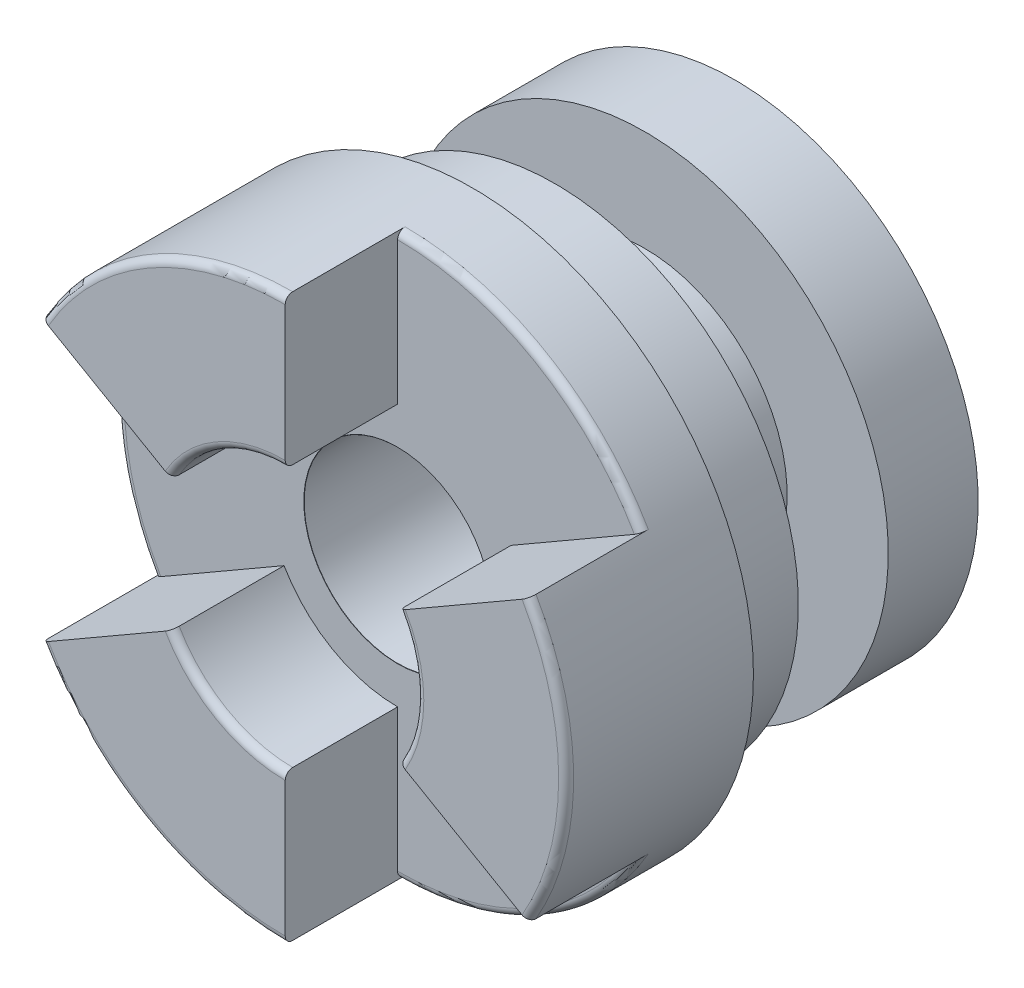
ISO-10303-21;
HEADER;
FILE_DESCRIPTION(('STEP AP214'),'2;1');
FILE_NAME('part.step','',(''),(''),'','','');
FILE_SCHEMA(('AUTOMOTIVE_DESIGN { 1 0 10303 214 1 1 1 1 }'));
ENDSEC;
DATA;
#1=APPLICATION_CONTEXT('core data for automotive mechanical design processes');
#2=APPLICATION_PROTOCOL_DEFINITION('international standard','automotive_design',2000,#1);
#3=PRODUCT_CONTEXT('',#1,'mechanical');
#4=PRODUCT('Part','Part','',(#3));
#5=PRODUCT_RELATED_PRODUCT_CATEGORY('part','',(#4));
#6=PRODUCT_DEFINITION_FORMATION('','',#4);
#7=PRODUCT_DEFINITION_CONTEXT('part definition',#1,'design');
#8=PRODUCT_DEFINITION('design','',#6,#7);
#9=PRODUCT_DEFINITION_SHAPE('','',#8);
#10=(LENGTH_UNIT() NAMED_UNIT(*) SI_UNIT(.MILLI.,.METRE.));
#11=(NAMED_UNIT(*) PLANE_ANGLE_UNIT() SI_UNIT($,.RADIAN.));
#12=(NAMED_UNIT(*) SI_UNIT($,.STERADIAN.) SOLID_ANGLE_UNIT());
#13=UNCERTAINTY_MEASURE_WITH_UNIT(LENGTH_MEASURE(1.E-05),#10,'distance_accuracy_value','');
#14=(GEOMETRIC_REPRESENTATION_CONTEXT(3) GLOBAL_UNCERTAINTY_ASSIGNED_CONTEXT((#13)) GLOBAL_UNIT_ASSIGNED_CONTEXT((#10,
#11,#12)) REPRESENTATION_CONTEXT('',''));
#15=CARTESIAN_POINT('',(0.,0.,0.));
#16=DIRECTION('',(0.,0.,1.));
#17=DIRECTION('',(1.,0.,0.));
#18=AXIS2_PLACEMENT_3D('',#15,#16,#17);
#19=CARTESIAN_POINT('',(0.,0.,-35.));
#20=DIRECTION('',(0.,0.,-1.));
#21=DIRECTION('',(-1.,0.,0.));
#22=AXIS2_PLACEMENT_3D('',#19,#20,#21);
#23=PLANE('',#22);
#24=CARTESIAN_POINT('',(0.,0.,-35.));
#25=DIRECTION('',(0.,0.,-1.));
#26=DIRECTION('',(-1.,0.,0.));
#27=AXIS2_PLACEMENT_3D('',#24,#25,#26);
#28=CIRCLE('',#27,32.5);
#29=CARTESIAN_POINT('',(-32.5,0.,-35.));
#30=VERTEX_POINT('',#29);
#31=EDGE_CURVE('E452',#30,#30,#28,.T.);
#32=ORIENTED_EDGE('',*,*,#31,.T.);
#33=EDGE_LOOP('',(#32));
#34=FACE_BOUND('',#33,.T.);
#35=CARTESIAN_POINT('',(0.,0.,-35.));
#36=DIRECTION('',(0.,0.,1.));
#37=DIRECTION('',(1.,0.,0.));
#38=AXIS2_PLACEMENT_3D('',#35,#36,#37);
#39=CIRCLE('',#38,12.5);
#40=CARTESIAN_POINT('',(11.7553179455087,4.25,-35.));
#41=VERTEX_POINT('',#40);
#42=CARTESIAN_POINT('',(11.7553179455087,-4.25,-35.));
#43=VERTEX_POINT('',#42);
#44=EDGE_CURVE('E520',#41,#43,#39,.T.);
#45=ORIENTED_EDGE('',*,*,#44,.T.);
#46=DIRECTION('',(-1.,0.,0.));
#47=VECTOR('',#46,1.);
#48=CARTESIAN_POINT('',(15.8,-4.25,-35.));
#49=LINE('',#48,#47);
#50=CARTESIAN_POINT('',(15.8,-4.25,-35.));
#51=VERTEX_POINT('',#50);
#52=EDGE_CURVE('E537',#51,#43,#49,.T.);
#53=ORIENTED_EDGE('',*,*,#52,.F.);
#54=DIRECTION('',(0.,1.,0.));
#55=VECTOR('',#54,1.);
#56=CARTESIAN_POINT('',(15.8,-4.25,-35.));
#57=LINE('',#56,#55);
#58=CARTESIAN_POINT('',(15.8,4.25,-35.));
#59=VERTEX_POINT('',#58);
#60=EDGE_CURVE('E535',#51,#59,#57,.T.);
#61=ORIENTED_EDGE('',*,*,#60,.T.);
#62=DIRECTION('',(-1.,0.,0.));
#63=VECTOR('',#62,1.);
#64=CARTESIAN_POINT('',(15.8,4.25,-35.));
#65=LINE('',#64,#63);
#66=EDGE_CURVE('E221',#59,#41,#65,.T.);
#67=ORIENTED_EDGE('',*,*,#66,.T.);
#68=EDGE_LOOP('',(#45,#53,#61,#67));
#69=FACE_BOUND('',#68,.T.);
#70=ADVANCED_FACE('F38',(#34,#69),#23,.T.);
#71=CARTESIAN_POINT('',(0.,0.,10.));
#72=DIRECTION('',(0.,0.,1.));
#73=DIRECTION('',(1.,0.,0.));
#74=AXIS2_PLACEMENT_3D('',#71,#72,#73);
#75=CYLINDRICAL_SURFACE('',#74,12.5);
#76=DIRECTION('',(0.,0.,1.));
#77=VECTOR('',#76,1.);
#78=CARTESIAN_POINT('',(11.7553179455087,-4.25,10.));
#79=LINE('',#78,#77);
#80=CARTESIAN_POINT('',(11.7553179455088,-4.25,9.975));
#81=VERTEX_POINT('',#80);
#82=EDGE_CURVE('E531',#43,#81,#79,.T.);
#83=ORIENTED_EDGE('',*,*,#82,.F.);
#84=ORIENTED_EDGE('',*,*,#44,.F.);
#85=DIRECTION('',(0.,0.,1.));
#86=VECTOR('',#85,1.);
#87=CARTESIAN_POINT('',(11.7553179455087,4.25,10.));
#88=LINE('',#87,#86);
#89=CARTESIAN_POINT('',(11.7553179455087,4.25,9.975));
#90=VERTEX_POINT('',#89);
#91=EDGE_CURVE('E533',#41,#90,#88,.T.);
#92=ORIENTED_EDGE('',*,*,#91,.T.);
#93=CARTESIAN_POINT('',(0.,0.,9.975));
#94=DIRECTION('',(0.,0.,1.));
#95=DIRECTION('',(1.,0.,0.));
#96=AXIS2_PLACEMENT_3D('',#93,#94,#95);
#97=CIRCLE('',#96,12.5);
#98=EDGE_CURVE('E527',#90,#81,#97,.T.);
#99=ORIENTED_EDGE('',*,*,#98,.T.);
#100=EDGE_LOOP('',(#83,#84,#92,#99));
#101=FACE_BOUND('',#100,.T.);
#102=ADVANCED_FACE('F274',(#101),#75,.F.);
#103=CARTESIAN_POINT('',(0.,0.,10.));
#104=DIRECTION('',(0.,0.,1.));
#105=DIRECTION('',(1.,0.,0.));
#106=AXIS2_PLACEMENT_3D('',#103,#104,#105);
#107=PLANE('',#106);
#108=DIRECTION('',(1.,0.,0.));
#109=VECTOR('',#108,1.);
#110=CARTESIAN_POINT('',(0.,-4.25,10.));
#111=LINE('',#110,#109);
#112=CARTESIAN_POINT('',(11.7818981917177,-4.25,10.));
#113=VERTEX_POINT('',#112);
#114=CARTESIAN_POINT('',(15.8,-4.25,10.));
#115=VERTEX_POINT('',#114);
#116=EDGE_CURVE('E233',#113,#115,#111,.T.);
#117=ORIENTED_EDGE('',*,*,#116,.F.);
#118=CARTESIAN_POINT('',(0.,0.,10.));
#119=DIRECTION('',(0.,0.,1.));
#120=DIRECTION('',(1.,0.,0.));
#121=AXIS2_PLACEMENT_3D('',#118,#119,#120);
#122=CIRCLE('',#121,12.525);
#123=CARTESIAN_POINT('',(11.7818981917177,4.25,10.));
#124=VERTEX_POINT('',#123);
#125=EDGE_CURVE('E239',#124,#113,#122,.T.);
#126=ORIENTED_EDGE('',*,*,#125,.F.);
#127=DIRECTION('',(-1.,0.,0.));
#128=VECTOR('',#127,1.);
#129=CARTESIAN_POINT('',(0.,4.25,10.));
#130=LINE('',#129,#128);
#131=CARTESIAN_POINT('',(15.8,4.25,10.));
#132=VERTEX_POINT('',#131);
#133=EDGE_CURVE('E218',#132,#124,#130,.T.);
#134=ORIENTED_EDGE('',*,*,#133,.F.);
#135=DIRECTION('',(0.,1.,0.));
#136=VECTOR('',#135,1.);
#137=CARTESIAN_POINT('',(15.8,0.,10.));
#138=LINE('',#137,#136);
#139=EDGE_CURVE('E225',#115,#132,#138,.T.);
#140=ORIENTED_EDGE('',*,*,#139,.F.);
#141=EDGE_LOOP('',(#117,#126,#134,#140));
#142=FACE_BOUND('',#141,.T.);
#143=DIRECTION('',(-0.866025403784436,0.500000000000004,0.));
#144=VECTOR('',#143,1.);
#145=CARTESIAN_POINT('',(0.,0.,10.));
#146=LINE('',#145,#144);
#147=CARTESIAN_POINT('',(-15.1554445662276,8.75000000000007,10.));
#148=VERTEX_POINT('',#147);
#149=CARTESIAN_POINT('',(-31.6099272381319,18.2500000000001,10.));
#150=VERTEX_POINT('',#149);
#151=EDGE_CURVE('E466',#148,#150,#146,.T.);
#152=ORIENTED_EDGE('',*,*,#151,.T.);
#153=CARTESIAN_POINT('',(0.,0.,10.));
#154=DIRECTION('',(0.,0.,1.));
#155=DIRECTION('',(1.,0.,0.));
#156=AXIS2_PLACEMENT_3D('',#153,#154,#155);
#157=CIRCLE('',#156,36.5);
#158=CARTESIAN_POINT('',(-31.6099272381322,-18.2499999999997,10.));
#159=VERTEX_POINT('',#158);
#160=EDGE_CURVE('E371',#150,#159,#157,.T.);
#161=ORIENTED_EDGE('',*,*,#160,.T.);
#162=DIRECTION('',(0.866025403784443,0.499999999999992,0.));
#163=VECTOR('',#162,1.);
#164=CARTESIAN_POINT('',(0.,0.,10.));
#165=LINE('',#164,#163);
#166=CARTESIAN_POINT('',(-15.1554445662278,-8.74999999999986,10.));
#167=VERTEX_POINT('',#166);
#168=EDGE_CURVE('E493',#159,#167,#165,.T.);
#169=ORIENTED_EDGE('',*,*,#168,.T.);
#170=CARTESIAN_POINT('',(0.,0.,10.));
#171=DIRECTION('',(0.,0.,1.));
#172=DIRECTION('',(1.,0.,0.));
#173=AXIS2_PLACEMENT_3D('',#170,#171,#172);
#174=CIRCLE('',#173,17.5);
#175=CARTESIAN_POINT('',(-2.41993924898765E-13,-17.5,10.));
#176=VERTEX_POINT('',#175);
#177=EDGE_CURVE('E495',#167,#176,#174,.T.);
#178=ORIENTED_EDGE('',*,*,#177,.T.);
#179=DIRECTION('',(0.,-1.,0.));
#180=VECTOR('',#179,1.);
#181=CARTESIAN_POINT('',(0.,0.,10.));
#182=LINE('',#181,#180);
#183=CARTESIAN_POINT('',(-5.06495886898328E-13,-36.5,10.));
#184=VERTEX_POINT('',#183);
#185=EDGE_CURVE('E490',#176,#184,#182,.T.);
#186=ORIENTED_EDGE('',*,*,#185,.T.);
#187=CARTESIAN_POINT('',(0.,0.,10.));
#188=DIRECTION('',(0.,0.,1.));
#189=DIRECTION('',(1.,0.,0.));
#190=AXIS2_PLACEMENT_3D('',#187,#188,#189);
#191=CIRCLE('',#190,36.5);
#192=CARTESIAN_POINT('',(31.6099272381319,-18.2500000000001,10.));
#193=VERTEX_POINT('',#192);
#194=EDGE_CURVE('E358',#184,#193,#191,.T.);
#195=ORIENTED_EDGE('',*,*,#194,.T.);
#196=DIRECTION('',(-0.866025403784436,0.500000000000004,0.));
#197=VECTOR('',#196,1.);
#198=CARTESIAN_POINT('',(0.,0.,10.));
#199=LINE('',#198,#197);
#200=CARTESIAN_POINT('',(15.1554445662276,-8.75000000000008,10.));
#201=VERTEX_POINT('',#200);
#202=EDGE_CURVE('E514',#193,#201,#199,.T.);
#203=ORIENTED_EDGE('',*,*,#202,.T.);
#204=CARTESIAN_POINT('',(0.,0.,10.));
#205=DIRECTION('',(0.,0.,1.));
#206=DIRECTION('',(1.,0.,0.));
#207=AXIS2_PLACEMENT_3D('',#204,#205,#206);
#208=CIRCLE('',#207,17.5);
#209=CARTESIAN_POINT('',(15.1554445662278,8.74999999999986,10.));
#210=VERTEX_POINT('',#209);
#211=EDGE_CURVE('E517',#201,#210,#208,.T.);
#212=ORIENTED_EDGE('',*,*,#211,.T.);
#213=DIRECTION('',(0.866025403784443,0.499999999999992,0.));
#214=VECTOR('',#213,1.);
#215=CARTESIAN_POINT('',(0.,0.,10.));
#216=LINE('',#215,#214);
#217=CARTESIAN_POINT('',(31.6099272381322,18.2499999999997,10.));
#218=VERTEX_POINT('',#217);
#219=EDGE_CURVE('E510',#210,#218,#216,.T.);
#220=ORIENTED_EDGE('',*,*,#219,.T.);
#221=CARTESIAN_POINT('',(0.,0.,10.));
#222=DIRECTION('',(0.,0.,1.));
#223=DIRECTION('',(1.,0.,0.));
#224=AXIS2_PLACEMENT_3D('',#221,#222,#223);
#225=CIRCLE('',#224,36.5);
#226=CARTESIAN_POINT('',(0.,36.5,10.));
#227=VERTEX_POINT('',#226);
#228=EDGE_CURVE('E374',#218,#227,#225,.T.);
#229=ORIENTED_EDGE('',*,*,#228,.T.);
#230=DIRECTION('',(0.,-1.,0.));
#231=VECTOR('',#230,1.);
#232=CARTESIAN_POINT('',(0.,0.,10.));
#233=LINE('',#232,#231);
#234=CARTESIAN_POINT('',(0.,17.5,10.));
#235=VERTEX_POINT('',#234);
#236=EDGE_CURVE('E470',#227,#235,#233,.T.);
#237=ORIENTED_EDGE('',*,*,#236,.T.);
#238=CARTESIAN_POINT('',(0.,0.,10.));
#239=DIRECTION('',(0.,0.,1.));
#240=DIRECTION('',(1.,0.,0.));
#241=AXIS2_PLACEMENT_3D('',#238,#239,#240);
#242=CIRCLE('',#241,17.5);
#243=EDGE_CURVE('E473',#235,#148,#242,.T.);
#244=ORIENTED_EDGE('',*,*,#243,.T.);
#245=EDGE_LOOP('',(#152,#161,#169,#178,#186,#195,#203,#212,#220,#229,#237,#244));
#246=FACE_BOUND('',#245,.T.);
#247=ADVANCED_FACE('F236',(#142,#246),#107,.T.);
#248=CARTESIAN_POINT('',(0.,0.,10.));
#249=DIRECTION('',(0.,0.,-1.));
#250=DIRECTION('',(-1.,0.,0.));
#251=AXIS2_PLACEMENT_3D('',#248,#249,#250);
#252=CYLINDRICAL_SURFACE('',#251,37.5);
#253=DIRECTION('',(0.,0.,-1.));
#254=VECTOR('',#253,1.);
#255=CARTESIAN_POINT('',(32.4759526419166,18.7499999999997,25.));
#256=LINE('',#255,#254);
#257=CARTESIAN_POINT('',(32.4759526419166,18.7499999999997,24.));
#258=VERTEX_POINT('',#257);
#259=CARTESIAN_POINT('',(32.4759526419166,18.7499999999997,9.));
#260=VERTEX_POINT('',#259);
#261=EDGE_CURVE('E505',#258,#260,#256,.T.);
#262=ORIENTED_EDGE('',*,*,#261,.F.);
#263=CARTESIAN_POINT('',(0.,0.,24.));
#264=DIRECTION('',(0.,0.,1.));
#265=DIRECTION('',(1.,0.,0.));
#266=AXIS2_PLACEMENT_3D('',#263,#264,#265);
#267=CIRCLE('',#266,37.5);
#268=CARTESIAN_POINT('',(32.4759526419164,-18.7500000000001,24.));
#269=VERTEX_POINT('',#268);
#270=EDGE_CURVE('E415',#258,#269,#267,.F.);
#271=ORIENTED_EDGE('',*,*,#270,.T.);
#272=DIRECTION('',(0.,0.,-1.));
#273=VECTOR('',#272,1.);
#274=CARTESIAN_POINT('',(32.4759526419164,-18.7500000000001,25.));
#275=LINE('',#274,#273);
#276=CARTESIAN_POINT('',(32.4759526419164,-18.7500000000001,9.));
#277=VERTEX_POINT('',#276);
#278=EDGE_CURVE('E503',#269,#277,#275,.T.);
#279=ORIENTED_EDGE('',*,*,#278,.T.);
#280=CARTESIAN_POINT('',(0.,0.,9.));
#281=DIRECTION('',(0.,0.,1.));
#282=DIRECTION('',(1.,0.,0.));
#283=AXIS2_PLACEMENT_3D('',#280,#281,#282);
#284=CIRCLE('',#283,37.5);
#285=CARTESIAN_POINT('',(-5.20417042793042E-13,-37.5,9.));
#286=VERTEX_POINT('',#285);
#287=EDGE_CURVE('E356',#277,#286,#284,.F.);
#288=ORIENTED_EDGE('',*,*,#287,.T.);
#289=DIRECTION('',(0.,0.,-1.));
#290=VECTOR('',#289,1.);
#291=CARTESIAN_POINT('',(-5.20417042793042E-13,-37.5,25.));
#292=LINE('',#291,#290);
#293=CARTESIAN_POINT('',(-5.20417042793042E-13,-37.5,24.));
#294=VERTEX_POINT('',#293);
#295=EDGE_CURVE('E485',#294,#286,#292,.T.);
#296=ORIENTED_EDGE('',*,*,#295,.F.);
#297=CARTESIAN_POINT('',(0.,0.,24.));
#298=DIRECTION('',(0.,0.,1.));
#299=DIRECTION('',(1.,0.,0.));
#300=AXIS2_PLACEMENT_3D('',#297,#298,#299);
#301=CIRCLE('',#300,37.5);
#302=CARTESIAN_POINT('',(-32.4759526419166,-18.7499999999997,24.));
#303=VERTEX_POINT('',#302);
#304=EDGE_CURVE('E419',#294,#303,#301,.F.);
#305=ORIENTED_EDGE('',*,*,#304,.T.);
#306=DIRECTION('',(0.,0.,-1.));
#307=VECTOR('',#306,1.);
#308=CARTESIAN_POINT('',(-32.4759526419166,-18.7499999999997,25.));
#309=LINE('',#308,#307);
#310=CARTESIAN_POINT('',(-32.4759526419166,-18.7499999999997,9.));
#311=VERTEX_POINT('',#310);
#312=EDGE_CURVE('E483',#303,#311,#309,.T.);
#313=ORIENTED_EDGE('',*,*,#312,.T.);
#314=CARTESIAN_POINT('',(0.,0.,9.));
#315=DIRECTION('',(0.,0.,1.));
#316=DIRECTION('',(1.,0.,0.));
#317=AXIS2_PLACEMENT_3D('',#314,#315,#316);
#318=CIRCLE('',#317,37.5);
#319=CARTESIAN_POINT('',(-32.4759526419164,18.7500000000001,9.));
#320=VERTEX_POINT('',#319);
#321=EDGE_CURVE('E421',#311,#320,#318,.F.);
#322=ORIENTED_EDGE('',*,*,#321,.T.);
#323=DIRECTION('',(0.,0.,-1.));
#324=VECTOR('',#323,1.);
#325=CARTESIAN_POINT('',(-32.4759526419164,18.7500000000001,25.));
#326=LINE('',#325,#324);
#327=CARTESIAN_POINT('',(-32.4759526419164,18.7500000000001,24.));
#328=VERTEX_POINT('',#327);
#329=EDGE_CURVE('E461',#328,#320,#326,.T.);
#330=ORIENTED_EDGE('',*,*,#329,.F.);
#331=CARTESIAN_POINT('',(0.,0.,24.));
#332=DIRECTION('',(0.,0.,1.));
#333=DIRECTION('',(1.,0.,0.));
#334=AXIS2_PLACEMENT_3D('',#331,#332,#333);
#335=CIRCLE('',#334,37.5);
#336=CARTESIAN_POINT('',(0.,37.5,24.));
#337=VERTEX_POINT('',#336);
#338=EDGE_CURVE('E417',#328,#337,#335,.F.);
#339=ORIENTED_EDGE('',*,*,#338,.T.);
#340=DIRECTION('',(0.,0.,-1.));
#341=VECTOR('',#340,1.);
#342=CARTESIAN_POINT('',(0.,37.5,25.));
#343=LINE('',#342,#341);
#344=CARTESIAN_POINT('',(0.,37.5,9.));
#345=VERTEX_POINT('',#344);
#346=EDGE_CURVE('E459',#337,#345,#343,.T.);
#347=ORIENTED_EDGE('',*,*,#346,.T.);
#348=CARTESIAN_POINT('',(0.,0.,9.));
#349=DIRECTION('',(0.,0.,1.));
#350=DIRECTION('',(1.,0.,0.));
#351=AXIS2_PLACEMENT_3D('',#348,#349,#350);
#352=CIRCLE('',#351,37.5);
#353=EDGE_CURVE('E425',#345,#260,#352,.F.);
#354=ORIENTED_EDGE('',*,*,#353,.T.);
#355=EDGE_LOOP('',(#262,#271,#279,#288,#296,#305,#313,#322,#330,#339,#347,#354));
#356=FACE_BOUND('',#355,.T.);
#357=CARTESIAN_POINT('',(0.,0.,0.));
#358=DIRECTION('',(0.,0.,1.));
#359=DIRECTION('',(1.,0.,0.));
#360=AXIS2_PLACEMENT_3D('',#357,#358,#359);
#361=CIRCLE('',#360,37.5);
#362=CARTESIAN_POINT('',(37.5,0.,0.));
#363=VERTEX_POINT('',#362);
#364=EDGE_CURVE('E438',#363,#363,#361,.T.);
#365=ORIENTED_EDGE('',*,*,#364,.T.);
#366=EDGE_LOOP('',(#365));
#367=FACE_BOUND('',#366,.T.);
#368=ADVANCED_FACE('F310',(#356,#367),#252,.T.);
#369=CARTESIAN_POINT('',(0.,0.,0.));
#370=DIRECTION('',(0.,0.,1.));
#371=DIRECTION('',(1.,0.,0.));
#372=AXIS2_PLACEMENT_3D('',#369,#370,#371);
#373=PLANE('',#372);
#374=CARTESIAN_POINT('',(0.,0.,0.));
#375=DIRECTION('',(0.,0.,-1.));
#376=DIRECTION('',(-1.,0.,0.));
#377=AXIS2_PLACEMENT_3D('',#374,#375,#376);
#378=CIRCLE('',#377,32.5);
#379=CARTESIAN_POINT('',(-32.5,0.,0.));
#380=VERTEX_POINT('',#379);
#381=EDGE_CURVE('E441',#380,#380,#378,.T.);
#382=ORIENTED_EDGE('',*,*,#381,.F.);
#383=EDGE_LOOP('',(#382));
#384=FACE_BOUND('',#383,.T.);
#385=ORIENTED_EDGE('',*,*,#364,.F.);
#386=EDGE_LOOP('',(#385));
#387=FACE_BOUND('',#386,.T.);
#388=ADVANCED_FACE('F306',(#384,#387),#373,.F.);
#389=CARTESIAN_POINT('',(0.,0.,-11.));
#390=DIRECTION('',(0.,0.,1.));
#391=DIRECTION('',(1.,0.,0.));
#392=AXIS2_PLACEMENT_3D('',#389,#390,#391);
#393=CYLINDRICAL_SURFACE('',#392,32.5);
#394=CARTESIAN_POINT('',(0.,0.,-11.));
#395=DIRECTION('',(0.,0.,-1.));
#396=DIRECTION('',(-1.,0.,0.));
#397=AXIS2_PLACEMENT_3D('',#394,#395,#396);
#398=CIRCLE('',#397,32.5);
#399=CARTESIAN_POINT('',(-32.5,0.,-11.));
#400=VERTEX_POINT('',#399);
#401=EDGE_CURVE('E442',#400,#400,#398,.T.);
#402=ORIENTED_EDGE('',*,*,#401,.F.);
#403=EDGE_LOOP('',(#402));
#404=FACE_BOUND('',#403,.T.);
#405=ORIENTED_EDGE('',*,*,#381,.T.);
#406=EDGE_LOOP('',(#405));
#407=FACE_BOUND('',#406,.T.);
#408=ADVANCED_FACE('F302',(#404,#407),#393,.T.);
#409=CARTESIAN_POINT('',(0.,0.,-11.));
#410=DIRECTION('',(0.,0.,-1.));
#411=DIRECTION('',(-1.,0.,0.));
#412=AXIS2_PLACEMENT_3D('',#409,#410,#411);
#413=PLANE('',#412);
#414=CARTESIAN_POINT('',(0.,0.,-11.));
#415=DIRECTION('',(0.,0.,-1.));
#416=DIRECTION('',(-1.,0.,0.));
#417=AXIS2_PLACEMENT_3D('',#414,#415,#416);
#418=CIRCLE('',#417,19.);
#419=CARTESIAN_POINT('',(-19.,0.,-11.));
#420=VERTEX_POINT('',#419);
#421=EDGE_CURVE('E437',#420,#420,#418,.T.);
#422=ORIENTED_EDGE('',*,*,#421,.F.);
#423=EDGE_LOOP('',(#422));
#424=FACE_BOUND('',#423,.T.);
#425=ORIENTED_EDGE('',*,*,#401,.T.);
#426=EDGE_LOOP('',(#425));
#427=FACE_BOUND('',#426,.T.);
#428=ADVANCED_FACE('F298',(#424,#427),#413,.T.);
#429=CARTESIAN_POINT('',(0.,0.,-23.));
#430=DIRECTION('',(0.,0.,1.));
#431=DIRECTION('',(1.,0.,0.));
#432=AXIS2_PLACEMENT_3D('',#429,#430,#431);
#433=CYLINDRICAL_SURFACE('',#432,19.);
#434=CARTESIAN_POINT('',(0.,0.,-23.));
#435=DIRECTION('',(0.,0.,-1.));
#436=DIRECTION('',(-1.,0.,0.));
#437=AXIS2_PLACEMENT_3D('',#434,#435,#436);
#438=CIRCLE('',#437,19.);
#439=CARTESIAN_POINT('',(-19.,0.,-23.));
#440=VERTEX_POINT('',#439);
#441=EDGE_CURVE('E447',#440,#440,#438,.T.);
#442=ORIENTED_EDGE('',*,*,#441,.F.);
#443=EDGE_LOOP('',(#442));
#444=FACE_BOUND('',#443,.T.);
#445=ORIENTED_EDGE('',*,*,#421,.T.);
#446=EDGE_LOOP('',(#445));
#447=FACE_BOUND('',#446,.T.);
#448=ADVANCED_FACE('F294',(#444,#447),#433,.T.);
#449=CARTESIAN_POINT('',(0.,0.,-35.));
#450=DIRECTION('',(0.,0.,1.));
#451=DIRECTION('',(1.,0.,0.));
#452=AXIS2_PLACEMENT_3D('',#449,#450,#451);
#453=CYLINDRICAL_SURFACE('',#452,32.5);
#454=ORIENTED_EDGE('',*,*,#31,.F.);
#455=EDGE_LOOP('',(#454));
#456=FACE_BOUND('',#455,.T.);
#457=CARTESIAN_POINT('',(0.,0.,-23.));
#458=DIRECTION('',(0.,0.,-1.));
#459=DIRECTION('',(-1.,0.,0.));
#460=AXIS2_PLACEMENT_3D('',#457,#458,#459);
#461=CIRCLE('',#460,32.5);
#462=CARTESIAN_POINT('',(-32.5,0.,-23.));
#463=VERTEX_POINT('',#462);
#464=EDGE_CURVE('E453',#463,#463,#461,.T.);
#465=ORIENTED_EDGE('',*,*,#464,.T.);
#466=EDGE_LOOP('',(#465));
#467=FACE_BOUND('',#466,.T.);
#468=ADVANCED_FACE('F290',(#456,#467),#453,.T.);
#469=CARTESIAN_POINT('',(0.,0.,-23.));
#470=DIRECTION('',(0.,0.,-1.));
#471=DIRECTION('',(-1.,0.,0.));
#472=AXIS2_PLACEMENT_3D('',#469,#470,#471);
#473=PLANE('',#472);
#474=ORIENTED_EDGE('',*,*,#441,.T.);
#475=EDGE_LOOP('',(#474));
#476=FACE_BOUND('',#475,.T.);
#477=ORIENTED_EDGE('',*,*,#464,.F.);
#478=EDGE_LOOP('',(#477));
#479=FACE_BOUND('',#478,.T.);
#480=ADVANCED_FACE('F287',(#476,#479),#473,.F.);
#481=CARTESIAN_POINT('',(0.,0.,25.));
#482=DIRECTION('',(0.,0.,-1.));
#483=DIRECTION('',(-1.,0.,0.));
#484=AXIS2_PLACEMENT_3D('',#481,#482,#483);
#485=CYLINDRICAL_SURFACE('',#484,17.5);
#486=DIRECTION('',(0.,0.,-1.));
#487=VECTOR('',#486,1.);
#488=CARTESIAN_POINT('',(0.,17.5,25.));
#489=LINE('',#488,#487);
#490=CARTESIAN_POINT('',(0.,17.5,24.));
#491=VERTEX_POINT('',#490);
#492=EDGE_CURVE('E456',#491,#235,#489,.T.);
#493=ORIENTED_EDGE('',*,*,#492,.F.);
#494=CARTESIAN_POINT('',(0.,0.,24.));
#495=DIRECTION('',(0.,0.,1.));
#496=DIRECTION('',(1.,0.,0.));
#497=AXIS2_PLACEMENT_3D('',#494,#495,#496);
#498=CIRCLE('',#497,17.5);
#499=CARTESIAN_POINT('',(-15.1554445662276,8.75000000000007,24.));
#500=VERTEX_POINT('',#499);
#501=EDGE_CURVE('E392',#491,#500,#498,.T.);
#502=ORIENTED_EDGE('',*,*,#501,.T.);
#503=DIRECTION('',(0.,0.,-1.));
#504=VECTOR('',#503,1.);
#505=CARTESIAN_POINT('',(-15.1554445662276,8.75000000000007,25.));
#506=LINE('',#505,#504);
#507=EDGE_CURVE('E463',#500,#148,#506,.T.);
#508=ORIENTED_EDGE('',*,*,#507,.T.);
#509=ORIENTED_EDGE('',*,*,#243,.F.);
#510=EDGE_LOOP('',(#493,#502,#508,#509));
#511=FACE_BOUND('',#510,.T.);
#512=ADVANCED_FACE('F285',(#511),#485,.F.);
#513=CARTESIAN_POINT('',(0.,0.,25.));
#514=DIRECTION('',(1.,0.,0.));
#515=DIRECTION('',(0.,1.,0.));
#516=AXIS2_PLACEMENT_3D('',#513,#514,#515);
#517=PLANE('',#516);
#518=ORIENTED_EDGE('',*,*,#346,.F.);
#519=CARTESIAN_POINT('',(0.,36.5,24.));
#520=DIRECTION('',(1.,0.,0.));
#521=DIRECTION('',(0.,1.,0.));
#522=AXIS2_PLACEMENT_3D('',#519,#520,#521);
#523=CIRCLE('',#522,1.);
#524=CARTESIAN_POINT('',(0.,36.5,25.));
#525=VERTEX_POINT('',#524);
#526=EDGE_CURVE('E395',#337,#525,#523,.T.);
#527=ORIENTED_EDGE('',*,*,#526,.T.);
#528=DIRECTION('',(0.,-1.,0.));
#529=VECTOR('',#528,1.);
#530=CARTESIAN_POINT('',(0.,0.,25.));
#531=LINE('',#530,#529);
#532=CARTESIAN_POINT('',(0.,18.5,25.));
#533=VERTEX_POINT('',#532);
#534=EDGE_CURVE('E469',#525,#533,#531,.T.);
#535=ORIENTED_EDGE('',*,*,#534,.T.);
#536=CARTESIAN_POINT('',(0.,18.5,24.));
#537=DIRECTION('',(1.,0.,0.));
#538=DIRECTION('',(0.,1.,0.));
#539=AXIS2_PLACEMENT_3D('',#536,#537,#538);
#540=CIRCLE('',#539,1.);
#541=EDGE_CURVE('E397',#533,#491,#540,.T.);
#542=ORIENTED_EDGE('',*,*,#541,.T.);
#543=ORIENTED_EDGE('',*,*,#492,.T.);
#544=ORIENTED_EDGE('',*,*,#236,.F.);
#545=CARTESIAN_POINT('',(0.,36.5,9.));
#546=DIRECTION('',(1.,0.,0.));
#547=DIRECTION('',(0.,1.,0.));
#548=AXIS2_PLACEMENT_3D('',#545,#546,#547);
#549=CIRCLE('',#548,1.);
#550=EDGE_CURVE('E46',#227,#345,#549,.F.);
#551=ORIENTED_EDGE('',*,*,#550,.T.);
#552=EDGE_LOOP('',(#518,#527,#535,#542,#543,#544,#551));
#553=FACE_BOUND('',#552,.T.);
#554=ADVANCED_FACE('F763',(#553),#517,.T.);
#555=CARTESIAN_POINT('',(0.,0.,25.));
#556=DIRECTION('',(-0.500000000000004,-0.866025403784436,0.));
#557=DIRECTION('',(0.866025403784436,-0.500000000000004,0.));
#558=AXIS2_PLACEMENT_3D('',#555,#556,#557);
#559=PLANE('',#558);
#560=DIRECTION('',(-0.866025403784436,0.500000000000004,0.));
#561=VECTOR('',#560,1.);
#562=CARTESIAN_POINT('',(0.,0.,25.));
#563=LINE('',#562,#561);
#564=CARTESIAN_POINT('',(-16.0214699700121,9.25000000000007,25.));
#565=VERTEX_POINT('',#564);
#566=CARTESIAN_POINT('',(-31.6099272381319,18.2500000000001,25.));
#567=VERTEX_POINT('',#566);
#568=EDGE_CURVE('E465',#565,#567,#563,.T.);
#569=ORIENTED_EDGE('',*,*,#568,.T.);
#570=CARTESIAN_POINT('',(-31.6099272381319,18.2500000000001,24.));
#571=DIRECTION('',(-0.500000000000004,-0.866025403784436,0.));
#572=DIRECTION('',(0.866025403784436,-0.500000000000004,0.));
#573=AXIS2_PLACEMENT_3D('',#570,#571,#572);
#574=CIRCLE('',#573,1.);
#575=EDGE_CURVE('E399',#567,#328,#574,.T.);
#576=ORIENTED_EDGE('',*,*,#575,.T.);
#577=ORIENTED_EDGE('',*,*,#329,.T.);
#578=CARTESIAN_POINT('',(-31.6099272381319,18.2500000000001,9.));
#579=DIRECTION('',(-0.500000000000004,-0.866025403784436,0.));
#580=DIRECTION('',(0.866025403784436,-0.500000000000004,0.));
#581=AXIS2_PLACEMENT_3D('',#578,#579,#580);
#582=CIRCLE('',#581,1.);
#583=EDGE_CURVE('E366',#320,#150,#582,.F.);
#584=ORIENTED_EDGE('',*,*,#583,.T.);
#585=ORIENTED_EDGE('',*,*,#151,.F.);
#586=ORIENTED_EDGE('',*,*,#507,.F.);
#587=CARTESIAN_POINT('',(-16.0214699700121,9.25000000000008,24.));
#588=DIRECTION('',(-0.500000000000004,-0.866025403784436,0.));
#589=DIRECTION('',(0.866025403784436,-0.500000000000004,0.));
#590=AXIS2_PLACEMENT_3D('',#587,#588,#589);
#591=CIRCLE('',#590,1.);
#592=EDGE_CURVE('E401',#500,#565,#591,.T.);
#593=ORIENTED_EDGE('',*,*,#592,.T.);
#594=EDGE_LOOP('',(#569,#576,#577,#584,#585,#586,#593));
#595=FACE_BOUND('',#594,.T.);
#596=ADVANCED_FACE('F752',(#595),#559,.T.);
#597=CARTESIAN_POINT('',(0.,0.,25.));
#598=DIRECTION('',(0.,0.,1.));
#599=DIRECTION('',(1.,0.,0.));
#600=AXIS2_PLACEMENT_3D('',#597,#598,#599);
#601=PLANE('',#600);
#602=ORIENTED_EDGE('',*,*,#534,.F.);
#603=CARTESIAN_POINT('',(0.,0.,25.));
#604=DIRECTION('',(0.,0.,1.));
#605=DIRECTION('',(1.,0.,0.));
#606=AXIS2_PLACEMENT_3D('',#603,#604,#605);
#607=CIRCLE('',#606,36.5);
#608=EDGE_CURVE('E403',#525,#567,#607,.T.);
#609=ORIENTED_EDGE('',*,*,#608,.T.);
#610=ORIENTED_EDGE('',*,*,#568,.F.);
#611=CARTESIAN_POINT('',(0.,0.,25.));
#612=DIRECTION('',(0.,0.,1.));
#613=DIRECTION('',(1.,0.,0.));
#614=AXIS2_PLACEMENT_3D('',#611,#612,#613);
#615=CIRCLE('',#614,18.5);
#616=EDGE_CURVE('E406',#565,#533,#615,.F.);
#617=ORIENTED_EDGE('',*,*,#616,.T.);
#618=EDGE_LOOP('',(#602,#609,#610,#617));
#619=FACE_BOUND('',#618,.T.);
#620=ADVANCED_FACE('F741',(#619),#601,.T.);
#621=CARTESIAN_POINT('',(0.,0.,25.));
#622=DIRECTION('',(0.,0.,-1.));
#623=DIRECTION('',(-1.,0.,0.));
#624=AXIS2_PLACEMENT_3D('',#621,#622,#623);
#625=CYLINDRICAL_SURFACE('',#624,17.5);
#626=DIRECTION('',(0.,0.,-1.));
#627=VECTOR('',#626,1.);
#628=CARTESIAN_POINT('',(-15.1554445662278,-8.74999999999986,25.));
#629=LINE('',#628,#627);
#630=CARTESIAN_POINT('',(-15.1554445662278,-8.74999999999986,24.));
#631=VERTEX_POINT('',#630);
#632=EDGE_CURVE('E476',#631,#167,#629,.T.);
#633=ORIENTED_EDGE('',*,*,#632,.F.);
#634=CARTESIAN_POINT('',(0.,0.,24.));
#635=DIRECTION('',(0.,0.,1.));
#636=DIRECTION('',(1.,0.,0.));
#637=AXIS2_PLACEMENT_3D('',#634,#635,#636);
#638=CIRCLE('',#637,17.5);
#639=CARTESIAN_POINT('',(-2.41993924898765E-13,-17.5,24.));
#640=VERTEX_POINT('',#639);
#641=EDGE_CURVE('E389',#631,#640,#638,.T.);
#642=ORIENTED_EDGE('',*,*,#641,.T.);
#643=DIRECTION('',(0.,0.,-1.));
#644=VECTOR('',#643,1.);
#645=CARTESIAN_POINT('',(-2.41993924898765E-13,-17.5,25.));
#646=LINE('',#645,#644);
#647=EDGE_CURVE('E487',#640,#176,#646,.T.);
#648=ORIENTED_EDGE('',*,*,#647,.T.);
#649=ORIENTED_EDGE('',*,*,#177,.F.);
#650=EDGE_LOOP('',(#633,#642,#648,#649));
#651=FACE_BOUND('',#650,.T.);
#652=ADVANCED_FACE('F730',(#651),#625,.F.);
#653=CARTESIAN_POINT('',(0.,0.,25.));
#654=DIRECTION('',(-0.499999999999992,0.866025403784443,0.));
#655=DIRECTION('',(-0.866025403784443,-0.499999999999992,0.));
#656=AXIS2_PLACEMENT_3D('',#653,#654,#655);
#657=PLANE('',#656);
#658=DIRECTION('',(0.866025403784443,0.499999999999992,0.));
#659=VECTOR('',#658,1.);
#660=CARTESIAN_POINT('',(0.,0.,25.));
#661=LINE('',#660,#659);
#662=CARTESIAN_POINT('',(-31.6099272381322,-18.2499999999997,25.));
#663=VERTEX_POINT('',#662);
#664=CARTESIAN_POINT('',(-16.0214699700122,-9.24999999999986,25.));
#665=VERTEX_POINT('',#664);
#666=EDGE_CURVE('E492',#663,#665,#661,.T.);
#667=ORIENTED_EDGE('',*,*,#666,.T.);
#668=CARTESIAN_POINT('',(-16.0214699700122,-9.24999999999986,24.));
#669=DIRECTION('',(-0.499999999999992,0.866025403784443,0.));
#670=DIRECTION('',(-0.866025403784443,-0.499999999999992,0.));
#671=AXIS2_PLACEMENT_3D('',#668,#669,#670);
#672=CIRCLE('',#671,1.);
#673=EDGE_CURVE('E377',#665,#631,#672,.T.);
#674=ORIENTED_EDGE('',*,*,#673,.T.);
#675=ORIENTED_EDGE('',*,*,#632,.T.);
#676=ORIENTED_EDGE('',*,*,#168,.F.);
#677=CARTESIAN_POINT('',(-31.6099272381322,-18.2499999999997,9.));
#678=DIRECTION('',(-0.499999999999992,0.866025403784443,0.));
#679=DIRECTION('',(-0.866025403784443,-0.499999999999992,0.));
#680=AXIS2_PLACEMENT_3D('',#677,#678,#679);
#681=CIRCLE('',#680,1.);
#682=EDGE_CURVE('E53',#159,#311,#681,.F.);
#683=ORIENTED_EDGE('',*,*,#682,.T.);
#684=ORIENTED_EDGE('',*,*,#312,.F.);
#685=CARTESIAN_POINT('',(-31.6099272381322,-18.2499999999997,24.));
#686=DIRECTION('',(-0.499999999999992,0.866025403784443,0.));
#687=DIRECTION('',(-0.866025403784443,-0.499999999999992,0.));
#688=AXIS2_PLACEMENT_3D('',#685,#686,#687);
#689=CIRCLE('',#688,1.);
#690=EDGE_CURVE('E379',#303,#663,#689,.T.);
#691=ORIENTED_EDGE('',*,*,#690,.T.);
#692=EDGE_LOOP('',(#667,#674,#675,#676,#683,#684,#691));
#693=FACE_BOUND('',#692,.T.);
#694=ADVANCED_FACE('F720',(#693),#657,.T.);
#695=CARTESIAN_POINT('',(0.,0.,25.));
#696=DIRECTION('',(1.,0.,0.));
#697=DIRECTION('',(0.,1.,0.));
#698=AXIS2_PLACEMENT_3D('',#695,#696,#697);
#699=PLANE('',#698);
#700=ORIENTED_EDGE('',*,*,#647,.F.);
#701=CARTESIAN_POINT('',(-2.57541384052207E-13,-18.5,24.));
#702=DIRECTION('',(1.,0.,0.));
#703=DIRECTION('',(0.,1.,0.));
#704=AXIS2_PLACEMENT_3D('',#701,#702,#703);
#705=CIRCLE('',#704,1.);
#706=CARTESIAN_POINT('',(-2.55915080793479E-13,-18.5,25.));
#707=VERTEX_POINT('',#706);
#708=EDGE_CURVE('E385',#640,#707,#705,.T.);
#709=ORIENTED_EDGE('',*,*,#708,.T.);
#710=DIRECTION('',(0.,-1.,0.));
#711=VECTOR('',#710,1.);
#712=CARTESIAN_POINT('',(0.,0.,25.));
#713=LINE('',#712,#711);
#714=CARTESIAN_POINT('',(-5.06495886898328E-13,-36.5,25.));
#715=VERTEX_POINT('',#714);
#716=EDGE_CURVE('E489',#707,#715,#713,.T.);
#717=ORIENTED_EDGE('',*,*,#716,.T.);
#718=CARTESIAN_POINT('',(-5.08122190157057E-13,-36.5,24.));
#719=DIRECTION('',(1.,0.,0.));
#720=DIRECTION('',(0.,1.,0.));
#721=AXIS2_PLACEMENT_3D('',#718,#719,#720);
#722=CIRCLE('',#721,1.);
#723=EDGE_CURVE('E387',#715,#294,#722,.T.);
#724=ORIENTED_EDGE('',*,*,#723,.T.);
#725=ORIENTED_EDGE('',*,*,#295,.T.);
#726=CARTESIAN_POINT('',(-5.08122190157057E-13,-36.5,9.));
#727=DIRECTION('',(1.,0.,0.));
#728=DIRECTION('',(0.,1.,0.));
#729=AXIS2_PLACEMENT_3D('',#726,#727,#728);
#730=CIRCLE('',#729,1.);
#731=EDGE_CURVE('E354',#286,#184,#730,.F.);
#732=ORIENTED_EDGE('',*,*,#731,.T.);
#733=ORIENTED_EDGE('',*,*,#185,.F.);
#734=EDGE_LOOP('',(#700,#709,#717,#724,#725,#732,#733));
#735=FACE_BOUND('',#734,.T.);
#736=ADVANCED_FACE('F710',(#735),#699,.T.);
#737=CARTESIAN_POINT('',(0.,0.,25.));
#738=DIRECTION('',(0.,0.,1.));
#739=DIRECTION('',(1.,0.,0.));
#740=AXIS2_PLACEMENT_3D('',#737,#738,#739);
#741=PLANE('',#740);
#742=ORIENTED_EDGE('',*,*,#716,.F.);
#743=CARTESIAN_POINT('',(0.,0.,25.));
#744=DIRECTION('',(0.,0.,1.));
#745=DIRECTION('',(1.,0.,0.));
#746=AXIS2_PLACEMENT_3D('',#743,#744,#745);
#747=CIRCLE('',#746,18.5);
#748=EDGE_CURVE('E61',#707,#665,#747,.F.);
#749=ORIENTED_EDGE('',*,*,#748,.T.);
#750=ORIENTED_EDGE('',*,*,#666,.F.);
#751=CARTESIAN_POINT('',(0.,0.,25.));
#752=DIRECTION('',(0.,0.,1.));
#753=DIRECTION('',(1.,0.,0.));
#754=AXIS2_PLACEMENT_3D('',#751,#752,#753);
#755=CIRCLE('',#754,36.5);
#756=EDGE_CURVE('E382',#663,#715,#755,.T.);
#757=ORIENTED_EDGE('',*,*,#756,.T.);
#758=EDGE_LOOP('',(#742,#749,#750,#757));
#759=FACE_BOUND('',#758,.T.);
#760=ADVANCED_FACE('F699',(#759),#741,.T.);
#761=CARTESIAN_POINT('',(0.,0.,25.));
#762=DIRECTION('',(0.,0.,-1.));
#763=DIRECTION('',(-1.,0.,0.));
#764=AXIS2_PLACEMENT_3D('',#761,#762,#763);
#765=CYLINDRICAL_SURFACE('',#764,17.5);
#766=DIRECTION('',(0.,0.,-1.));
#767=VECTOR('',#766,1.);
#768=CARTESIAN_POINT('',(15.1554445662276,-8.75000000000008,25.));
#769=LINE('',#768,#767);
#770=CARTESIAN_POINT('',(15.1554445662276,-8.75000000000008,24.));
#771=VERTEX_POINT('',#770);
#772=EDGE_CURVE('E498',#771,#201,#769,.T.);
#773=ORIENTED_EDGE('',*,*,#772,.F.);
#774=CARTESIAN_POINT('',(0.,0.,24.));
#775=DIRECTION('',(0.,0.,1.));
#776=DIRECTION('',(1.,0.,0.));
#777=AXIS2_PLACEMENT_3D('',#774,#775,#776);
#778=CIRCLE('',#777,17.5);
#779=CARTESIAN_POINT('',(15.1554445662278,8.74999999999986,24.));
#780=VERTEX_POINT('',#779);
#781=EDGE_CURVE('E408',#771,#780,#778,.T.);
#782=ORIENTED_EDGE('',*,*,#781,.T.);
#783=DIRECTION('',(0.,0.,-1.));
#784=VECTOR('',#783,1.);
#785=CARTESIAN_POINT('',(15.1554445662278,8.74999999999986,25.));
#786=LINE('',#785,#784);
#787=EDGE_CURVE('E507',#780,#210,#786,.T.);
#788=ORIENTED_EDGE('',*,*,#787,.T.);
#789=ORIENTED_EDGE('',*,*,#211,.F.);
#790=EDGE_LOOP('',(#773,#782,#788,#789));
#791=FACE_BOUND('',#790,.T.);
#792=ADVANCED_FACE('F688',(#791),#765,.F.);
#793=CARTESIAN_POINT('',(0.,0.,25.));
#794=DIRECTION('',(-0.500000000000004,-0.866025403784436,0.));
#795=DIRECTION('',(0.866025403784436,-0.500000000000004,0.));
#796=AXIS2_PLACEMENT_3D('',#793,#794,#795);
#797=PLANE('',#796);
#798=ORIENTED_EDGE('',*,*,#278,.F.);
#799=CARTESIAN_POINT('',(31.6099272381319,-18.2500000000001,24.));
#800=DIRECTION('',(-0.500000000000004,-0.866025403784436,0.));
#801=DIRECTION('',(0.866025403784436,-0.500000000000004,0.));
#802=AXIS2_PLACEMENT_3D('',#799,#800,#801);
#803=CIRCLE('',#802,1.);
#804=CARTESIAN_POINT('',(31.6099272381319,-18.2500000000001,25.));
#805=VERTEX_POINT('',#804);
#806=EDGE_CURVE('E411',#269,#805,#803,.T.);
#807=ORIENTED_EDGE('',*,*,#806,.T.);
#808=DIRECTION('',(-0.866025403784436,0.500000000000004,0.));
#809=VECTOR('',#808,1.);
#810=CARTESIAN_POINT('',(0.,0.,25.));
#811=LINE('',#810,#809);
#812=CARTESIAN_POINT('',(16.0214699700121,-9.25000000000008,25.));
#813=VERTEX_POINT('',#812);
#814=EDGE_CURVE('E513',#805,#813,#811,.T.);
#815=ORIENTED_EDGE('',*,*,#814,.T.);
#816=CARTESIAN_POINT('',(16.0214699700121,-9.25000000000007,24.));
#817=DIRECTION('',(-0.500000000000004,-0.866025403784436,0.));
#818=DIRECTION('',(0.866025403784436,-0.500000000000004,0.));
#819=AXIS2_PLACEMENT_3D('',#816,#817,#818);
#820=CIRCLE('',#819,1.);
#821=EDGE_CURVE('E413',#813,#771,#820,.T.);
#822=ORIENTED_EDGE('',*,*,#821,.T.);
#823=ORIENTED_EDGE('',*,*,#772,.T.);
#824=ORIENTED_EDGE('',*,*,#202,.F.);
#825=CARTESIAN_POINT('',(31.6099272381319,-18.2500000000001,9.));
#826=DIRECTION('',(-0.500000000000004,-0.866025403784436,0.));
#827=DIRECTION('',(0.866025403784436,-0.500000000000004,0.));
#828=AXIS2_PLACEMENT_3D('',#825,#826,#827);
#829=CIRCLE('',#828,1.);
#830=EDGE_CURVE('E362',#193,#277,#829,.F.);
#831=ORIENTED_EDGE('',*,*,#830,.T.);
#832=EDGE_LOOP('',(#798,#807,#815,#822,#823,#824,#831));
#833=FACE_BOUND('',#832,.T.);
#834=ADVANCED_FACE('F677',(#833),#797,.T.);
#835=CARTESIAN_POINT('',(0.,0.,25.));
#836=DIRECTION('',(-0.499999999999992,0.866025403784443,0.));
#837=DIRECTION('',(-0.866025403784443,-0.499999999999992,0.));
#838=AXIS2_PLACEMENT_3D('',#835,#836,#837);
#839=PLANE('',#838);
#840=DIRECTION('',(0.866025403784443,0.499999999999992,0.));
#841=VECTOR('',#840,1.);
#842=CARTESIAN_POINT('',(0.,0.,25.));
#843=LINE('',#842,#841);
#844=CARTESIAN_POINT('',(16.0214699700122,9.24999999999986,25.));
#845=VERTEX_POINT('',#844);
#846=CARTESIAN_POINT('',(31.6099272381322,18.2499999999997,25.));
#847=VERTEX_POINT('',#846);
#848=EDGE_CURVE('E509',#845,#847,#843,.T.);
#849=ORIENTED_EDGE('',*,*,#848,.T.);
#850=CARTESIAN_POINT('',(31.6099272381322,18.2499999999997,24.));
#851=DIRECTION('',(-0.499999999999992,0.866025403784443,0.));
#852=DIRECTION('',(-0.866025403784443,-0.499999999999992,0.));
#853=AXIS2_PLACEMENT_3D('',#850,#851,#852);
#854=CIRCLE('',#853,1.);
#855=EDGE_CURVE('E428',#847,#258,#854,.T.);
#856=ORIENTED_EDGE('',*,*,#855,.T.);
#857=ORIENTED_EDGE('',*,*,#261,.T.);
#858=CARTESIAN_POINT('',(31.6099272381322,18.2499999999997,9.));
#859=DIRECTION('',(-0.499999999999992,0.866025403784443,0.));
#860=DIRECTION('',(-0.866025403784443,-0.499999999999992,0.));
#861=AXIS2_PLACEMENT_3D('',#858,#859,#860);
#862=CIRCLE('',#861,1.);
#863=EDGE_CURVE('E11',#260,#218,#862,.F.);
#864=ORIENTED_EDGE('',*,*,#863,.T.);
#865=ORIENTED_EDGE('',*,*,#219,.F.);
#866=ORIENTED_EDGE('',*,*,#787,.F.);
#867=CARTESIAN_POINT('',(16.0214699700122,9.24999999999985,24.));
#868=DIRECTION('',(-0.499999999999992,0.866025403784443,0.));
#869=DIRECTION('',(-0.866025403784443,-0.499999999999992,0.));
#870=AXIS2_PLACEMENT_3D('',#867,#868,#869);
#871=CIRCLE('',#870,1.);
#872=EDGE_CURVE('E430',#780,#845,#871,.T.);
#873=ORIENTED_EDGE('',*,*,#872,.T.);
#874=EDGE_LOOP('',(#849,#856,#857,#864,#865,#866,#873));
#875=FACE_BOUND('',#874,.T.);
#876=ADVANCED_FACE('F666',(#875),#839,.T.);
#877=CARTESIAN_POINT('',(0.,0.,25.));
#878=DIRECTION('',(0.,0.,1.));
#879=DIRECTION('',(1.,0.,0.));
#880=AXIS2_PLACEMENT_3D('',#877,#878,#879);
#881=PLANE('',#880);
#882=ORIENTED_EDGE('',*,*,#814,.F.);
#883=CARTESIAN_POINT('',(0.,0.,25.));
#884=DIRECTION('',(0.,0.,1.));
#885=DIRECTION('',(1.,0.,0.));
#886=AXIS2_PLACEMENT_3D('',#883,#884,#885);
#887=CIRCLE('',#886,36.5);
#888=EDGE_CURVE('E432',#805,#847,#887,.T.);
#889=ORIENTED_EDGE('',*,*,#888,.T.);
#890=ORIENTED_EDGE('',*,*,#848,.F.);
#891=CARTESIAN_POINT('',(0.,0.,25.));
#892=DIRECTION('',(0.,0.,1.));
#893=DIRECTION('',(1.,0.,0.));
#894=AXIS2_PLACEMENT_3D('',#891,#892,#893);
#895=CIRCLE('',#894,18.5);
#896=EDGE_CURVE('E435',#845,#813,#895,.F.);
#897=ORIENTED_EDGE('',*,*,#896,.T.);
#898=EDGE_LOOP('',(#882,#889,#890,#897));
#899=FACE_BOUND('',#898,.T.);
#900=ADVANCED_FACE('F321',(#899),#881,.T.);
#901=CARTESIAN_POINT('',(0.,0.,24.));
#902=DIRECTION('',(0.,0.,1.));
#903=DIRECTION('',(1.,0.,0.));
#904=AXIS2_PLACEMENT_3D('',#901,#902,#903);
#905=TOROIDAL_SURFACE('',#904,36.5,1.);
#906=ORIENTED_EDGE('',*,*,#806,.F.);
#907=ORIENTED_EDGE('',*,*,#270,.F.);
#908=ORIENTED_EDGE('',*,*,#855,.F.);
#909=ORIENTED_EDGE('',*,*,#888,.F.);
#910=EDGE_LOOP('',(#906,#907,#908,#909));
#911=FACE_BOUND('',#910,.T.);
#912=ADVANCED_FACE('F317',(#911),#905,.T.);
#913=CARTESIAN_POINT('',(0.,0.,24.));
#914=DIRECTION('',(0.,0.,1.));
#915=DIRECTION('',(1.,0.,0.));
#916=AXIS2_PLACEMENT_3D('',#913,#914,#915);
#917=TOROIDAL_SURFACE('',#916,18.5,1.);
#918=ORIENTED_EDGE('',*,*,#821,.F.);
#919=ORIENTED_EDGE('',*,*,#896,.F.);
#920=ORIENTED_EDGE('',*,*,#872,.F.);
#921=ORIENTED_EDGE('',*,*,#781,.F.);
#922=EDGE_LOOP('',(#918,#919,#920,#921));
#923=FACE_BOUND('',#922,.T.);
#924=ADVANCED_FACE('F320',(#923),#917,.T.);
#925=CARTESIAN_POINT('',(0.,0.,24.));
#926=DIRECTION('',(0.,0.,1.));
#927=DIRECTION('',(1.,0.,0.));
#928=AXIS2_PLACEMENT_3D('',#925,#926,#927);
#929=TOROIDAL_SURFACE('',#928,36.5,1.);
#930=ORIENTED_EDGE('',*,*,#526,.F.);
#931=ORIENTED_EDGE('',*,*,#338,.F.);
#932=ORIENTED_EDGE('',*,*,#575,.F.);
#933=ORIENTED_EDGE('',*,*,#608,.F.);
#934=EDGE_LOOP('',(#930,#931,#932,#933));
#935=FACE_BOUND('',#934,.T.);
#936=ADVANCED_FACE('F325',(#935),#929,.T.);
#937=CARTESIAN_POINT('',(0.,0.,24.));
#938=DIRECTION('',(0.,0.,1.));
#939=DIRECTION('',(1.,0.,0.));
#940=AXIS2_PLACEMENT_3D('',#937,#938,#939);
#941=TOROIDAL_SURFACE('',#940,18.5,1.);
#942=ORIENTED_EDGE('',*,*,#541,.F.);
#943=ORIENTED_EDGE('',*,*,#616,.F.);
#944=ORIENTED_EDGE('',*,*,#592,.F.);
#945=ORIENTED_EDGE('',*,*,#501,.F.);
#946=EDGE_LOOP('',(#942,#943,#944,#945));
#947=FACE_BOUND('',#946,.T.);
#948=ADVANCED_FACE('F329',(#947),#941,.T.);
#949=CARTESIAN_POINT('',(0.,0.,24.));
#950=DIRECTION('',(0.,0.,1.));
#951=DIRECTION('',(1.,0.,0.));
#952=AXIS2_PLACEMENT_3D('',#949,#950,#951);
#953=TOROIDAL_SURFACE('',#952,18.5,1.);
#954=ORIENTED_EDGE('',*,*,#673,.F.);
#955=ORIENTED_EDGE('',*,*,#748,.F.);
#956=ORIENTED_EDGE('',*,*,#708,.F.);
#957=ORIENTED_EDGE('',*,*,#641,.F.);
#958=EDGE_LOOP('',(#954,#955,#956,#957));
#959=FACE_BOUND('',#958,.T.);
#960=ADVANCED_FACE('F333',(#959),#953,.T.);
#961=CARTESIAN_POINT('',(0.,0.,24.));
#962=DIRECTION('',(0.,0.,1.));
#963=DIRECTION('',(1.,0.,0.));
#964=AXIS2_PLACEMENT_3D('',#961,#962,#963);
#965=TOROIDAL_SURFACE('',#964,36.5,1.);
#966=ORIENTED_EDGE('',*,*,#690,.F.);
#967=ORIENTED_EDGE('',*,*,#304,.F.);
#968=ORIENTED_EDGE('',*,*,#723,.F.);
#969=ORIENTED_EDGE('',*,*,#756,.F.);
#970=EDGE_LOOP('',(#966,#967,#968,#969));
#971=FACE_BOUND('',#970,.T.);
#972=ADVANCED_FACE('F337',(#971),#965,.T.);
#973=CARTESIAN_POINT('',(0.,0.,9.));
#974=DIRECTION('',(0.,0.,1.));
#975=DIRECTION('',(1.,0.,0.));
#976=AXIS2_PLACEMENT_3D('',#973,#974,#975);
#977=TOROIDAL_SURFACE('',#976,36.5,1.);
#978=ORIENTED_EDGE('',*,*,#583,.F.);
#979=ORIENTED_EDGE('',*,*,#321,.F.);
#980=ORIENTED_EDGE('',*,*,#682,.F.);
#981=ORIENTED_EDGE('',*,*,#160,.F.);
#982=EDGE_LOOP('',(#978,#979,#980,#981));
#983=FACE_BOUND('',#982,.T.);
#984=ADVANCED_FACE('F341',(#983),#977,.T.);
#985=CARTESIAN_POINT('',(0.,0.,9.));
#986=DIRECTION('',(0.,0.,1.));
#987=DIRECTION('',(1.,0.,0.));
#988=AXIS2_PLACEMENT_3D('',#985,#986,#987);
#989=TOROIDAL_SURFACE('',#988,36.5,1.);
#990=ORIENTED_EDGE('',*,*,#731,.F.);
#991=ORIENTED_EDGE('',*,*,#287,.F.);
#992=ORIENTED_EDGE('',*,*,#830,.F.);
#993=ORIENTED_EDGE('',*,*,#194,.F.);
#994=EDGE_LOOP('',(#990,#991,#992,#993));
#995=FACE_BOUND('',#994,.T.);
#996=ADVANCED_FACE('F344',(#995),#989,.T.);
#997=CARTESIAN_POINT('',(0.,0.,9.));
#998=DIRECTION('',(0.,0.,1.));
#999=DIRECTION('',(1.,0.,0.));
#1000=AXIS2_PLACEMENT_3D('',#997,#998,#999);
#1001=TOROIDAL_SURFACE('',#1000,36.5,1.);
#1002=ORIENTED_EDGE('',*,*,#863,.F.);
#1003=ORIENTED_EDGE('',*,*,#353,.F.);
#1004=ORIENTED_EDGE('',*,*,#550,.F.);
#1005=ORIENTED_EDGE('',*,*,#228,.F.);
#1006=EDGE_LOOP('',(#1002,#1003,#1004,#1005));
#1007=FACE_BOUND('',#1006,.T.);
#1008=ADVANCED_FACE('F40',(#1007),#1001,.T.);
#1009=CARTESIAN_POINT('',(0.,0.,10.));
#1010=DIRECTION('',(0.,0.,1.));
#1011=DIRECTION('',(1.,0.,0.));
#1012=AXIS2_PLACEMENT_3D('',#1009,#1010,#1011);
#1013=CONICAL_SURFACE('',#1012,12.525,0.785398163397483);
#1014=ORIENTED_EDGE('',*,*,#125,.T.);
#1015=CARTESIAN_POINT('',(12.597705422806,-4.25,10.7702879592656));
#1016=CARTESIAN_POINT('',(12.4637835211969,-4.25,10.6433935704736));
#1017=CARTESIAN_POINT('',(12.3297591857346,-4.25,10.5166072081824));
#1018=CARTESIAN_POINT('',(12.0614848908855,-4.25,10.2632744718557));
#1019=CARTESIAN_POINT('',(11.9272349323768,-4.25,10.1367280968902));
#1020=CARTESIAN_POINT('',(11.6584875074958,-4.25,9.88389820184252));
#1021=CARTESIAN_POINT('',(11.5239900409613,-4.25,9.7576146819327));
#1022=CARTESIAN_POINT('',(11.2547215033252,-4.25,9.50533864787077));
#1023=CARTESIAN_POINT('',(11.1199504311628,-4.25,9.37934613485097));
#1024=CARTESIAN_POINT('',(10.9850299862431,-4.25,9.25351364980582));
#1025=B_SPLINE_CURVE_WITH_KNOTS('',3,(#1015,#1016,#1017,#1018,#1019,#1020,#1021,#1022,#1023,
#1024),.UNSPECIFIED.,.F.,.F.,(4,2,2,2,4),(0.,0.553475722744352,1.10694929655579,
1.66042323331414,2.21389932003819),.UNSPECIFIED.);
#1026=EDGE_CURVE('E240',#113,#81,#1025,.T.);
#1027=ORIENTED_EDGE('',*,*,#1026,.T.);
#1028=ORIENTED_EDGE('',*,*,#98,.F.);
#1029=CARTESIAN_POINT('',(10.9850299862431,4.25,9.25351364980582));
#1030=CARTESIAN_POINT('',(11.1199504311628,4.25,9.37934613485097));
#1031=CARTESIAN_POINT('',(11.2547215033252,4.25,9.50533864787077));
#1032=CARTESIAN_POINT('',(11.5239900409613,4.25,9.7576146819327));
#1033=CARTESIAN_POINT('',(11.6584875074958,4.25,9.88389820184251));
#1034=CARTESIAN_POINT('',(11.9272349323768,4.25,10.1367280968902));
#1035=CARTESIAN_POINT('',(12.0614848908855,4.25,10.2632744718557));
#1036=CARTESIAN_POINT('',(12.3297591857346,4.25,10.5166072081824));
#1037=CARTESIAN_POINT('',(12.4637835211969,4.25,10.6433935704736));
#1038=CARTESIAN_POINT('',(12.597705422806,4.25,10.7702879592656));
#1039=B_SPLINE_CURVE_WITH_KNOTS('',3,(#1029,#1030,#1031,#1032,#1033,#1034,#1035,#1036,#1037,
#1038),.UNSPECIFIED.,.F.,.F.,(4,2,2,2,4),(0.,0.553476086724051,1.10695002348241,
1.66042359729385,2.2138993200382),.UNSPECIFIED.);
#1040=EDGE_CURVE('E241',#90,#124,#1039,.T.);
#1041=ORIENTED_EDGE('',*,*,#1040,.T.);
#1042=EDGE_LOOP('',(#1014,#1027,#1028,#1041));
#1043=FACE_BOUND('',#1042,.T.);
#1044=ADVANCED_FACE('F258',(#1043),#1013,.F.);
#1045=CARTESIAN_POINT('',(0.,-4.25,0.));
#1046=DIRECTION('',(0.,1.,0.));
#1047=DIRECTION('',(0.,0.,1.));
#1048=AXIS2_PLACEMENT_3D('',#1045,#1046,#1047);
#1049=PLANE('',#1048);
#1050=ORIENTED_EDGE('',*,*,#82,.T.);
#1051=ORIENTED_EDGE('',*,*,#1026,.F.);
#1052=ORIENTED_EDGE('',*,*,#116,.T.);
#1053=DIRECTION('',(0.,0.,-1.));
#1054=VECTOR('',#1053,1.);
#1055=CARTESIAN_POINT('',(15.8,-4.25,9.975));
#1056=LINE('',#1055,#1054);
#1057=EDGE_CURVE('E229',#115,#51,#1056,.T.);
#1058=ORIENTED_EDGE('',*,*,#1057,.T.);
#1059=ORIENTED_EDGE('',*,*,#52,.T.);
#1060=EDGE_LOOP('',(#1050,#1051,#1052,#1058,#1059));
#1061=FACE_BOUND('',#1060,.T.);
#1062=ADVANCED_FACE('F265',(#1061),#1049,.T.);
#1063=CARTESIAN_POINT('',(0.,4.25,0.));
#1064=DIRECTION('',(0.,1.,0.));
#1065=DIRECTION('',(0.,0.,1.));
#1066=AXIS2_PLACEMENT_3D('',#1063,#1064,#1065);
#1067=PLANE('',#1066);
#1068=ORIENTED_EDGE('',*,*,#66,.F.);
#1069=DIRECTION('',(0.,0.,-1.));
#1070=VECTOR('',#1069,1.);
#1071=CARTESIAN_POINT('',(15.8,4.25,9.975));
#1072=LINE('',#1071,#1070);
#1073=EDGE_CURVE('E213',#132,#59,#1072,.T.);
#1074=ORIENTED_EDGE('',*,*,#1073,.F.);
#1075=ORIENTED_EDGE('',*,*,#133,.T.);
#1076=ORIENTED_EDGE('',*,*,#1040,.F.);
#1077=ORIENTED_EDGE('',*,*,#91,.F.);
#1078=EDGE_LOOP('',(#1068,#1074,#1075,#1076,#1077));
#1079=FACE_BOUND('',#1078,.T.);
#1080=ADVANCED_FACE('F215',(#1079),#1067,.F.);
#1081=CARTESIAN_POINT('',(15.8,-4.25,9.975));
#1082=DIRECTION('',(1.,0.,0.));
#1083=DIRECTION('',(0.,0.,-1.));
#1084=AXIS2_PLACEMENT_3D('',#1081,#1082,#1083);
#1085=PLANE('',#1084);
#1086=ORIENTED_EDGE('',*,*,#60,.F.);
#1087=ORIENTED_EDGE('',*,*,#1057,.F.);
#1088=ORIENTED_EDGE('',*,*,#139,.T.);
#1089=ORIENTED_EDGE('',*,*,#1073,.T.);
#1090=EDGE_LOOP('',(#1086,#1087,#1088,#1089));
#1091=FACE_BOUND('',#1090,.T.);
#1092=ADVANCED_FACE('F228',(#1091),#1085,.F.);
#1093=CLOSED_SHELL('',(#70,#102,#247,#368,#388,#408,#428,#448,#468,#480,#512,#554,#596,#620,
#652,#694,#736,#760,#792,#834,#876,#900,#912,#924,#936,#948,#960,#972,#984,#996,#1008,#1044,
#1062,#1080,#1092));
#1094=MANIFOLD_SOLID_BREP('B2',#1093);
#1095=ADVANCED_BREP_SHAPE_REPRESENTATION('',(#18,#1094),#14);
#1096=SHAPE_DEFINITION_REPRESENTATION(#9,#1095);
ENDSEC;
END-ISO-10303-21;
